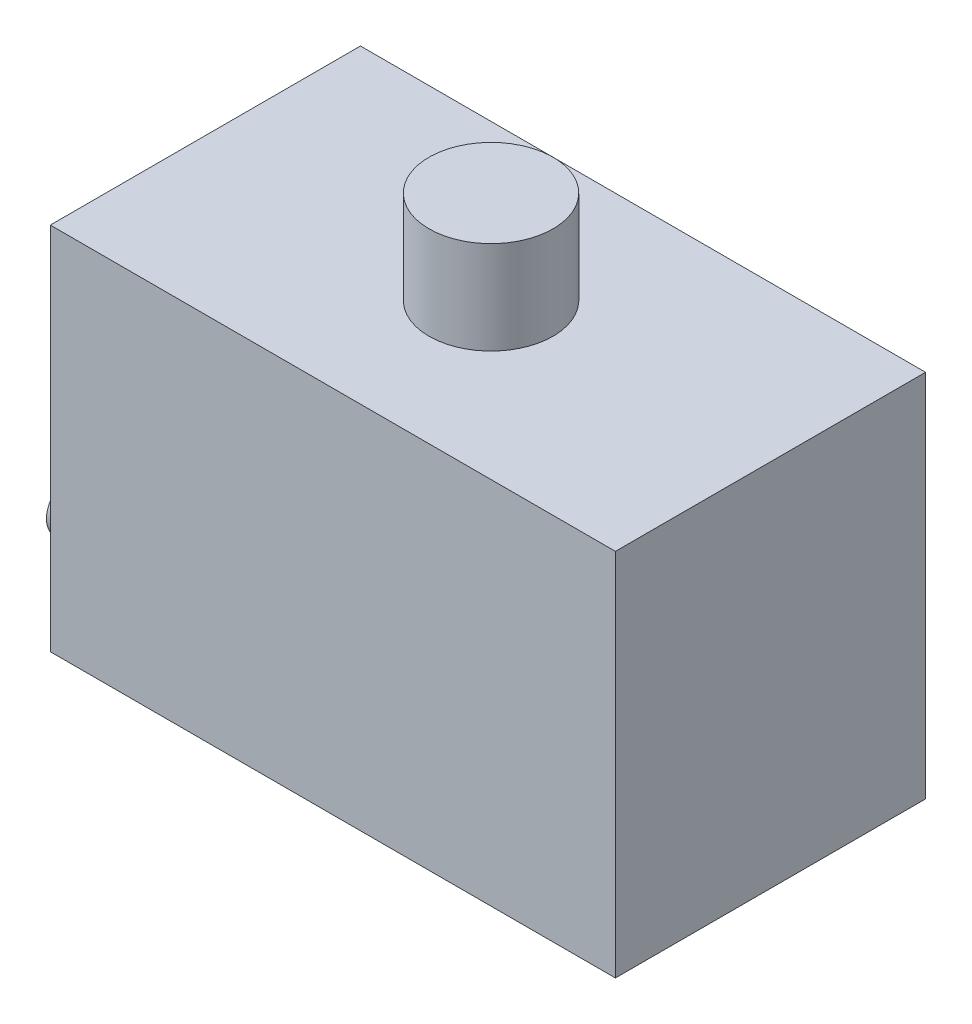
ISO-10303-21;
HEADER;
FILE_DESCRIPTION(('STEP AP214'),'2;1');
FILE_NAME('part.step','',(''),(''),'','','');
FILE_SCHEMA(('AUTOMOTIVE_DESIGN { 1 0 10303 214 1 1 1 1 }'));
ENDSEC;
DATA;
#1=APPLICATION_CONTEXT('core data for automotive mechanical design processes');
#2=APPLICATION_PROTOCOL_DEFINITION('international standard','automotive_design',2000,#1);
#3=PRODUCT_CONTEXT('',#1,'mechanical');
#4=PRODUCT('Part','Part','',(#3));
#5=PRODUCT_RELATED_PRODUCT_CATEGORY('part','',(#4));
#6=PRODUCT_DEFINITION_FORMATION('','',#4);
#7=PRODUCT_DEFINITION_CONTEXT('part definition',#1,'design');
#8=PRODUCT_DEFINITION('design','',#6,#7);
#9=PRODUCT_DEFINITION_SHAPE('','',#8);
#10=(LENGTH_UNIT() NAMED_UNIT(*) SI_UNIT(.MILLI.,.METRE.));
#11=(NAMED_UNIT(*) PLANE_ANGLE_UNIT() SI_UNIT($,.RADIAN.));
#12=(NAMED_UNIT(*) SI_UNIT($,.STERADIAN.) SOLID_ANGLE_UNIT());
#13=UNCERTAINTY_MEASURE_WITH_UNIT(LENGTH_MEASURE(1.E-05),#10,'distance_accuracy_value','');
#14=(GEOMETRIC_REPRESENTATION_CONTEXT(3) GLOBAL_UNCERTAINTY_ASSIGNED_CONTEXT((#13)) GLOBAL_UNIT_ASSIGNED_CONTEXT((#10,
#11,#12)) REPRESENTATION_CONTEXT('',''));
#15=CARTESIAN_POINT('',(0.,0.,0.));
#16=DIRECTION('',(0.,0.,1.));
#17=DIRECTION('',(1.,0.,0.));
#18=AXIS2_PLACEMENT_3D('',#15,#16,#17);
#19=CARTESIAN_POINT('',(-46.050254843329,29.2819555253776,50.));
#20=DIRECTION('',(1.,0.,0.));
#21=DIRECTION('',(0.,1.,0.));
#22=AXIS2_PLACEMENT_3D('',#19,#20,#21);
#23=PLANE('',#22);
#24=CARTESIAN_POINT('',(-46.050254843329,-16.4061623758016,41.5132538329317));
#25=DIRECTION('',(1.,0.,0.));
#26=DIRECTION('',(0.,1.,0.));
#27=AXIS2_PLACEMENT_3D('',#24,#25,#26);
#28=CIRCLE('',#27,4.10934011903672);
#29=CARTESIAN_POINT('',(-46.050254843329,-12.2968222567649,41.5132538329317));
#30=VERTEX_POINT('',#29);
#31=EDGE_CURVE('E38',#30,#30,#28,.F.);
#32=ORIENTED_EDGE('',*,*,#31,.F.);
#33=EDGE_LOOP('',(#32));
#34=FACE_BOUND('',#33,.T.);
#35=DIRECTION('',(0.,-1.,0.));
#36=VECTOR('',#35,1.);
#37=CARTESIAN_POINT('',(-46.050254843329,29.2819555253776,0.));
#38=LINE('',#37,#36);
#39=CARTESIAN_POINT('',(-46.050254843329,29.2819555253776,0.));
#40=VERTEX_POINT('',#39);
#41=CARTESIAN_POINT('',(-46.050254843329,-30.2830480219719,0.));
#42=VERTEX_POINT('',#41);
#43=EDGE_CURVE('E103',#40,#42,#38,.T.);
#44=ORIENTED_EDGE('',*,*,#43,.T.);
#45=DIRECTION('',(0.,0.,-1.));
#46=VECTOR('',#45,1.);
#47=CARTESIAN_POINT('',(-46.050254843329,-30.2830480219719,50.));
#48=LINE('',#47,#46);
#49=CARTESIAN_POINT('',(-46.050254843329,-30.2830480219719,50.));
#50=VERTEX_POINT('',#49);
#51=EDGE_CURVE('E94',#50,#42,#48,.T.);
#52=ORIENTED_EDGE('',*,*,#51,.F.);
#53=DIRECTION('',(0.,-1.,0.));
#54=VECTOR('',#53,1.);
#55=CARTESIAN_POINT('',(-46.050254843329,29.2819555253776,50.));
#56=LINE('',#55,#54);
#57=CARTESIAN_POINT('',(-46.050254843329,29.2819555253776,50.));
#58=VERTEX_POINT('',#57);
#59=EDGE_CURVE('E88',#58,#50,#56,.T.);
#60=ORIENTED_EDGE('',*,*,#59,.F.);
#61=DIRECTION('',(0.,0.,-1.));
#62=VECTOR('',#61,1.);
#63=CARTESIAN_POINT('',(-46.050254843329,29.2819555253776,50.));
#64=LINE('',#63,#62);
#65=EDGE_CURVE('E99',#58,#40,#64,.T.);
#66=ORIENTED_EDGE('',*,*,#65,.T.);
#67=EDGE_LOOP('',(#44,#52,#60,#66));
#68=FACE_BOUND('',#67,.T.);
#69=ADVANCED_FACE('F35',(#34,#68),#23,.F.);
#70=CARTESIAN_POINT('',(-46.050254843329,-30.2830480219719,50.));
#71=DIRECTION('',(0.,1.,0.));
#72=DIRECTION('',(0.,0.,1.));
#73=AXIS2_PLACEMENT_3D('',#70,#71,#72);
#74=PLANE('',#73);
#75=DIRECTION('',(1.,0.,0.));
#76=VECTOR('',#75,1.);
#77=CARTESIAN_POINT('',(-46.050254843329,-30.2830480219719,0.));
#78=LINE('',#77,#76);
#79=CARTESIAN_POINT('',(45.049162346735,-30.2830480219719,0.));
#80=VERTEX_POINT('',#79);
#81=EDGE_CURVE('E93',#42,#80,#78,.T.);
#82=ORIENTED_EDGE('',*,*,#81,.T.);
#83=DIRECTION('',(0.,0.,-1.));
#84=VECTOR('',#83,1.);
#85=CARTESIAN_POINT('',(45.049162346735,-30.2830480219719,50.));
#86=LINE('',#85,#84);
#87=CARTESIAN_POINT('',(45.049162346735,-30.2830480219719,50.));
#88=VERTEX_POINT('',#87);
#89=EDGE_CURVE('E91',#88,#80,#86,.T.);
#90=ORIENTED_EDGE('',*,*,#89,.F.);
#91=DIRECTION('',(1.,0.,0.));
#92=VECTOR('',#91,1.);
#93=CARTESIAN_POINT('',(-46.050254843329,-30.2830480219719,50.));
#94=LINE('',#93,#92);
#95=EDGE_CURVE('E83',#50,#88,#94,.T.);
#96=ORIENTED_EDGE('',*,*,#95,.F.);
#97=ORIENTED_EDGE('',*,*,#51,.T.);
#98=EDGE_LOOP('',(#82,#90,#96,#97));
#99=FACE_BOUND('',#98,.T.);
#100=ADVANCED_FACE('F92',(#99),#74,.F.);
#101=CARTESIAN_POINT('',(45.049162346735,29.2819555253776,50.));
#102=DIRECTION('',(-1.,0.,0.));
#103=DIRECTION('',(0.,0.,1.));
#104=AXIS2_PLACEMENT_3D('',#101,#102,#103);
#105=PLANE('',#104);
#106=DIRECTION('',(0.,1.,0.));
#107=VECTOR('',#106,1.);
#108=CARTESIAN_POINT('',(45.049162346735,29.2819555253776,0.));
#109=LINE('',#108,#107);
#110=CARTESIAN_POINT('',(45.049162346735,29.2819555253776,0.));
#111=VERTEX_POINT('',#110);
#112=EDGE_CURVE('E69',#80,#111,#109,.T.);
#113=ORIENTED_EDGE('',*,*,#112,.T.);
#114=DIRECTION('',(0.,0.,-1.));
#115=VECTOR('',#114,1.);
#116=CARTESIAN_POINT('',(45.049162346735,29.2819555253776,50.));
#117=LINE('',#116,#115);
#118=CARTESIAN_POINT('',(45.049162346735,29.2819555253776,50.));
#119=VERTEX_POINT('',#118);
#120=EDGE_CURVE('E95',#119,#111,#117,.T.);
#121=ORIENTED_EDGE('',*,*,#120,.F.);
#122=DIRECTION('',(0.,1.,0.));
#123=VECTOR('',#122,1.);
#124=CARTESIAN_POINT('',(45.049162346735,29.2819555253776,50.));
#125=LINE('',#124,#123);
#126=EDGE_CURVE('E86',#88,#119,#125,.T.);
#127=ORIENTED_EDGE('',*,*,#126,.F.);
#128=ORIENTED_EDGE('',*,*,#89,.T.);
#129=EDGE_LOOP('',(#113,#121,#127,#128));
#130=FACE_BOUND('',#129,.T.);
#131=ADVANCED_FACE('F97',(#130),#105,.F.);
#132=CARTESIAN_POINT('',(-46.050254843329,29.2819555253776,50.));
#133=DIRECTION('',(0.,-1.,0.));
#134=DIRECTION('',(0.,0.,-1.));
#135=AXIS2_PLACEMENT_3D('',#132,#133,#134);
#136=PLANE('',#135);
#137=CARTESIAN_POINT('',(0.,29.2819555253776,25.));
#138=DIRECTION('',(0.,1.,0.));
#139=DIRECTION('',(0.,0.,1.));
#140=AXIS2_PLACEMENT_3D('',#137,#138,#139);
#141=CIRCLE('',#140,10.);
#142=CARTESIAN_POINT('',(0.,29.2819555253776,35.));
#143=VERTEX_POINT('',#142);
#144=EDGE_CURVE('E11',#143,#143,#141,.T.);
#145=ORIENTED_EDGE('',*,*,#144,.F.);
#146=EDGE_LOOP('',(#145));
#147=FACE_BOUND('',#146,.T.);
#148=DIRECTION('',(-1.,0.,0.));
#149=VECTOR('',#148,1.);
#150=CARTESIAN_POINT('',(-46.050254843329,29.2819555253776,0.));
#151=LINE('',#150,#149);
#152=EDGE_CURVE('E75',#111,#40,#151,.T.);
#153=ORIENTED_EDGE('',*,*,#152,.T.);
#154=ORIENTED_EDGE('',*,*,#65,.F.);
#155=DIRECTION('',(-1.,0.,0.));
#156=VECTOR('',#155,1.);
#157=CARTESIAN_POINT('',(-46.050254843329,29.2819555253776,50.));
#158=LINE('',#157,#156);
#159=EDGE_CURVE('E52',#119,#58,#158,.T.);
#160=ORIENTED_EDGE('',*,*,#159,.F.);
#161=ORIENTED_EDGE('',*,*,#120,.T.);
#162=EDGE_LOOP('',(#153,#154,#160,#161));
#163=FACE_BOUND('',#162,.T.);
#164=ADVANCED_FACE('F130',(#147,#163),#136,.F.);
#165=CARTESIAN_POINT('',(0.,0.,50.));
#166=DIRECTION('',(0.,0.,1.));
#167=DIRECTION('',(1.,0.,0.));
#168=AXIS2_PLACEMENT_3D('',#165,#166,#167);
#169=PLANE('',#168);
#170=ORIENTED_EDGE('',*,*,#59,.T.);
#171=ORIENTED_EDGE('',*,*,#95,.T.);
#172=ORIENTED_EDGE('',*,*,#126,.T.);
#173=ORIENTED_EDGE('',*,*,#159,.T.);
#174=EDGE_LOOP('',(#170,#171,#172,#173));
#175=FACE_BOUND('',#174,.T.);
#176=ADVANCED_FACE('F84',(#175),#169,.T.);
#177=CARTESIAN_POINT('',(0.,0.,0.));
#178=DIRECTION('',(0.,0.,1.));
#179=DIRECTION('',(1.,0.,0.));
#180=AXIS2_PLACEMENT_3D('',#177,#178,#179);
#181=PLANE('',#180);
#182=ORIENTED_EDGE('',*,*,#43,.F.);
#183=ORIENTED_EDGE('',*,*,#152,.F.);
#184=ORIENTED_EDGE('',*,*,#112,.F.);
#185=ORIENTED_EDGE('',*,*,#81,.F.);
#186=EDGE_LOOP('',(#182,#183,#184,#185));
#187=FACE_BOUND('',#186,.T.);
#188=ADVANCED_FACE('F120',(#187),#181,.F.);
#189=CARTESIAN_POINT('',(-51.0502548433289,-16.4061623758016,41.5132538329317));
#190=DIRECTION('',(1.,0.,0.));
#191=DIRECTION('',(0.,1.,0.));
#192=AXIS2_PLACEMENT_3D('',#189,#190,#191);
#193=CYLINDRICAL_SURFACE('',#192,4.10934011903672);
#194=CARTESIAN_POINT('',(-51.0502548433289,-16.4061623758016,41.5132538329317));
#195=DIRECTION('',(-1.,0.,0.));
#196=DIRECTION('',(0.,-1.,0.));
#197=AXIS2_PLACEMENT_3D('',#194,#195,#196);
#198=CIRCLE('',#197,4.10934011903672);
#199=CARTESIAN_POINT('',(-51.0502548433289,-20.5155024948383,41.5132538329317));
#200=VERTEX_POINT('',#199);
#201=EDGE_CURVE('E106',#200,#200,#198,.T.);
#202=ORIENTED_EDGE('',*,*,#201,.F.);
#203=EDGE_LOOP('',(#202));
#204=FACE_BOUND('',#203,.T.);
#205=ORIENTED_EDGE('',*,*,#31,.T.);
#206=EDGE_LOOP('',(#205));
#207=FACE_BOUND('',#206,.T.);
#208=ADVANCED_FACE('F114',(#204,#207),#193,.T.);
#209=CARTESIAN_POINT('',(-51.0502548433289,-16.4061623758016,41.5132538329317));
#210=DIRECTION('',(-1.,0.,0.));
#211=DIRECTION('',(0.,-1.,0.));
#212=AXIS2_PLACEMENT_3D('',#209,#210,#211);
#213=PLANE('',#212);
#214=ORIENTED_EDGE('',*,*,#201,.T.);
#215=EDGE_LOOP('',(#214));
#216=FACE_BOUND('',#215,.T.);
#217=ADVANCED_FACE('F127',(#216),#213,.T.);
#218=CARTESIAN_POINT('',(0.,44.2819555253776,25.));
#219=DIRECTION('',(0.,-1.,0.));
#220=DIRECTION('',(0.,0.,-1.));
#221=AXIS2_PLACEMENT_3D('',#218,#219,#220);
#222=CYLINDRICAL_SURFACE('',#221,10.);
#223=CARTESIAN_POINT('',(0.,44.2819555253776,25.));
#224=DIRECTION('',(0.,1.,0.));
#225=DIRECTION('',(0.,0.,1.));
#226=AXIS2_PLACEMENT_3D('',#223,#224,#225);
#227=CIRCLE('',#226,10.);
#228=CARTESIAN_POINT('',(0.,44.2819555253776,35.));
#229=VERTEX_POINT('',#228);
#230=EDGE_CURVE('E203',#229,#229,#227,.T.);
#231=ORIENTED_EDGE('',*,*,#230,.F.);
#232=EDGE_LOOP('',(#231));
#233=FACE_BOUND('',#232,.T.);
#234=ORIENTED_EDGE('',*,*,#144,.T.);
#235=EDGE_LOOP('',(#234));
#236=FACE_BOUND('',#235,.T.);
#237=ADVANCED_FACE('F177',(#233,#236),#222,.T.);
#238=CARTESIAN_POINT('',(0.,44.2819555253776,25.));
#239=DIRECTION('',(0.,1.,0.));
#240=DIRECTION('',(0.,0.,1.));
#241=AXIS2_PLACEMENT_3D('',#238,#239,#240);
#242=PLANE('',#241);
#243=ORIENTED_EDGE('',*,*,#230,.T.);
#244=EDGE_LOOP('',(#243));
#245=FACE_BOUND('',#244,.T.);
#246=ADVANCED_FACE('F187',(#245),#242,.T.);
#247=CLOSED_SHELL('',(#69,#100,#131,#164,#176,#188,#208,#217,#237,#246));
#248=MANIFOLD_SOLID_BREP('B2',#247);
#249=ADVANCED_BREP_SHAPE_REPRESENTATION('',(#18,#248),#14);
#250=SHAPE_DEFINITION_REPRESENTATION(#9,#249);
ENDSEC;
END-ISO-10303-21;
